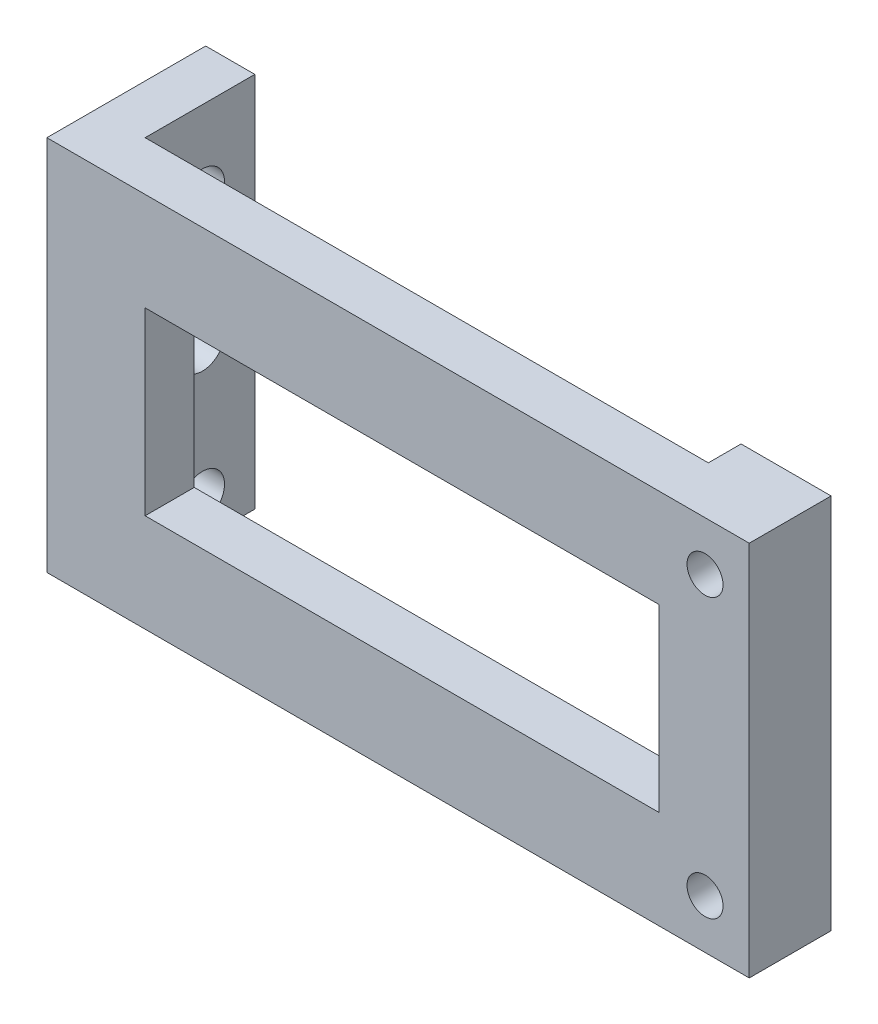
ISO-10303-21;
HEADER;
FILE_DESCRIPTION(('STEP AP214'),'2;1');
FILE_NAME('part.step','',(''),(''),'','','');
FILE_SCHEMA(('AUTOMOTIVE_DESIGN { 1 0 10303 214 1 1 1 1 }'));
ENDSEC;
DATA;
#1=APPLICATION_CONTEXT('core data for automotive mechanical design processes');
#2=APPLICATION_PROTOCOL_DEFINITION('international standard','automotive_design',2000,#1);
#3=PRODUCT_CONTEXT('',#1,'mechanical');
#4=PRODUCT('Part','Part','',(#3));
#5=PRODUCT_RELATED_PRODUCT_CATEGORY('part','',(#4));
#6=PRODUCT_DEFINITION_FORMATION('','',#4);
#7=PRODUCT_DEFINITION_CONTEXT('part definition',#1,'design');
#8=PRODUCT_DEFINITION('design','',#6,#7);
#9=PRODUCT_DEFINITION_SHAPE('','',#8);
#10=(LENGTH_UNIT() NAMED_UNIT(*) SI_UNIT(.MILLI.,.METRE.));
#11=(NAMED_UNIT(*) PLANE_ANGLE_UNIT() SI_UNIT($,.RADIAN.));
#12=(NAMED_UNIT(*) SI_UNIT($,.STERADIAN.) SOLID_ANGLE_UNIT());
#13=UNCERTAINTY_MEASURE_WITH_UNIT(LENGTH_MEASURE(1.E-05),#10,'distance_accuracy_value','');
#14=(GEOMETRIC_REPRESENTATION_CONTEXT(3) GLOBAL_UNCERTAINTY_ASSIGNED_CONTEXT((#13)) GLOBAL_UNIT_ASSIGNED_CONTEXT((#10,
#11,#12)) REPRESENTATION_CONTEXT('',''));
#15=CARTESIAN_POINT('',(0.,0.,0.));
#16=DIRECTION('',(0.,0.,1.));
#17=DIRECTION('',(1.,0.,0.));
#18=AXIS2_PLACEMENT_3D('',#15,#16,#17);
#19=CARTESIAN_POINT('',(-14.6316233815926,-9.25000000000001,-6.5));
#20=DIRECTION('',(-1.,0.,0.));
#21=DIRECTION('',(0.,-1.,0.));
#22=AXIS2_PLACEMENT_3D('',#19,#20,#21);
#23=CYLINDRICAL_SURFACE('',#22,1.35);
#24=CARTESIAN_POINT('',(-18.45,-9.25000000000001,-6.5));
#25=DIRECTION('',(-1.,0.,0.));
#26=DIRECTION('',(0.,-1.,0.));
#27=AXIS2_PLACEMENT_3D('',#24,#25,#26);
#28=CIRCLE('',#27,1.35);
#29=CARTESIAN_POINT('',(-18.45,-10.6,-6.5));
#30=VERTEX_POINT('',#29);
#31=EDGE_CURVE('E50',#30,#30,#28,.F.);
#32=ORIENTED_EDGE('',*,*,#31,.T.);
#33=EDGE_LOOP('',(#32));
#34=FACE_BOUND('',#33,.T.);
#35=CARTESIAN_POINT('',(-21.45,-9.25000000000001,-6.5));
#36=DIRECTION('',(-1.,0.,0.));
#37=DIRECTION('',(0.,-1.,0.));
#38=AXIS2_PLACEMENT_3D('',#35,#36,#37);
#39=CIRCLE('',#38,1.35);
#40=CARTESIAN_POINT('',(-21.45,-10.6,-6.5));
#41=VERTEX_POINT('',#40);
#42=EDGE_CURVE('E11',#41,#41,#39,.T.);
#43=ORIENTED_EDGE('',*,*,#42,.T.);
#44=EDGE_LOOP('',(#43));
#45=FACE_BOUND('',#44,.T.);
#46=ADVANCED_FACE('F41',(#34,#45),#23,.F.);
#47=CARTESIAN_POINT('',(0.,-5.5,-3.));
#48=DIRECTION('',(0.,-1.,0.));
#49=DIRECTION('',(0.,0.,-1.));
#50=AXIS2_PLACEMENT_3D('',#47,#48,#49);
#51=PLANE('',#50);
#52=DIRECTION('',(1.,0.,0.));
#53=VECTOR('',#52,1.);
#54=CARTESIAN_POINT('',(0.,-5.5,0.));
#55=LINE('',#54,#53);
#56=CARTESIAN_POINT('',(-15.45,-5.5,0.));
#57=VERTEX_POINT('',#56);
#58=CARTESIAN_POINT('',(15.95,-5.5,0.));
#59=VERTEX_POINT('',#58);
#60=EDGE_CURVE('E79',#57,#59,#55,.T.);
#61=ORIENTED_EDGE('',*,*,#60,.T.);
#62=DIRECTION('',(0.,0.,1.));
#63=VECTOR('',#62,1.);
#64=CARTESIAN_POINT('',(15.95,-5.5,-3.));
#65=LINE('',#64,#63);
#66=CARTESIAN_POINT('',(15.95,-5.5,-3.));
#67=VERTEX_POINT('',#66);
#68=EDGE_CURVE('E230',#67,#59,#65,.T.);
#69=ORIENTED_EDGE('',*,*,#68,.F.);
#70=DIRECTION('',(1.,0.,0.));
#71=VECTOR('',#70,1.);
#72=CARTESIAN_POINT('',(0.,-5.5,-3.));
#73=LINE('',#72,#71);
#74=CARTESIAN_POINT('',(-15.45,-5.5,-3.));
#75=VERTEX_POINT('',#74);
#76=EDGE_CURVE('E58',#75,#67,#73,.T.);
#77=ORIENTED_EDGE('',*,*,#76,.F.);
#78=DIRECTION('',(0.,0.,1.));
#79=VECTOR('',#78,1.);
#80=CARTESIAN_POINT('',(-15.45,-5.5,-3.));
#81=LINE('',#80,#79);
#82=EDGE_CURVE('E239',#75,#57,#81,.T.);
#83=ORIENTED_EDGE('',*,*,#82,.T.);
#84=EDGE_LOOP('',(#61,#69,#77,#83));
#85=FACE_BOUND('',#84,.T.);
#86=ADVANCED_FACE('F264',(#85),#51,.F.);
#87=CARTESIAN_POINT('',(0.,-11.5,-3.));
#88=DIRECTION('',(0.,1.,0.));
#89=DIRECTION('',(-1.,0.,0.));
#90=AXIS2_PLACEMENT_3D('',#87,#88,#89);
#91=PLANE('',#90);
#92=DIRECTION('',(-1.,0.,0.));
#93=VECTOR('',#92,1.);
#94=CARTESIAN_POINT('',(0.,-11.5,0.));
#95=LINE('',#94,#93);
#96=CARTESIAN_POINT('',(21.45,-11.5,0.));
#97=VERTEX_POINT('',#96);
#98=CARTESIAN_POINT('',(-21.45,-11.5,0.));
#99=VERTEX_POINT('',#98);
#100=EDGE_CURVE('E202',#97,#99,#95,.T.);
#101=ORIENTED_EDGE('',*,*,#100,.T.);
#102=DIRECTION('',(0.,0.,1.));
#103=VECTOR('',#102,1.);
#104=CARTESIAN_POINT('',(-21.45,-11.5,-9.7));
#105=LINE('',#104,#103);
#106=CARTESIAN_POINT('',(-21.45,-11.5,-9.7));
#107=VERTEX_POINT('',#106);
#108=EDGE_CURVE('E139',#107,#99,#105,.T.);
#109=ORIENTED_EDGE('',*,*,#108,.F.);
#110=DIRECTION('',(-1.,0.,0.));
#111=VECTOR('',#110,1.);
#112=CARTESIAN_POINT('',(0.,-11.5,-9.7));
#113=LINE('',#112,#111);
#114=CARTESIAN_POINT('',(-18.45,-11.5,-9.7));
#115=VERTEX_POINT('',#114);
#116=EDGE_CURVE('E134',#115,#107,#113,.T.);
#117=ORIENTED_EDGE('',*,*,#116,.F.);
#118=DIRECTION('',(0.,0.,1.));
#119=VECTOR('',#118,1.);
#120=CARTESIAN_POINT('',(-18.45,-11.5,-9.7));
#121=LINE('',#120,#119);
#122=CARTESIAN_POINT('',(-18.45,-11.5,-3.));
#123=VERTEX_POINT('',#122);
#124=EDGE_CURVE('E175',#115,#123,#121,.T.);
#125=ORIENTED_EDGE('',*,*,#124,.T.);
#126=DIRECTION('',(-1.,0.,0.));
#127=VECTOR('',#126,1.);
#128=CARTESIAN_POINT('',(0.,-11.5,-3.));
#129=LINE('',#128,#127);
#130=CARTESIAN_POINT('',(15.95,-11.5,-3.));
#131=VERTEX_POINT('',#130);
#132=EDGE_CURVE('E105',#131,#123,#129,.T.);
#133=ORIENTED_EDGE('',*,*,#132,.F.);
#134=DIRECTION('',(0.,0.,1.));
#135=VECTOR('',#134,1.);
#136=CARTESIAN_POINT('',(15.95,-11.5,-5.));
#137=LINE('',#136,#135);
#138=CARTESIAN_POINT('',(15.95,-11.5,-5.));
#139=VERTEX_POINT('',#138);
#140=EDGE_CURVE('E194',#139,#131,#137,.T.);
#141=ORIENTED_EDGE('',*,*,#140,.F.);
#142=DIRECTION('',(-1.,0.,0.));
#143=VECTOR('',#142,1.);
#144=CARTESIAN_POINT('',(0.,-11.5,-5.));
#145=LINE('',#144,#143);
#146=CARTESIAN_POINT('',(21.45,-11.5,-5.));
#147=VERTEX_POINT('',#146);
#148=EDGE_CURVE('E162',#147,#139,#145,.T.);
#149=ORIENTED_EDGE('',*,*,#148,.F.);
#150=DIRECTION('',(0.,0.,1.));
#151=VECTOR('',#150,1.);
#152=CARTESIAN_POINT('',(21.45,-11.5,-5.));
#153=LINE('',#152,#151);
#154=EDGE_CURVE('E190',#147,#97,#153,.T.);
#155=ORIENTED_EDGE('',*,*,#154,.T.);
#156=EDGE_LOOP('',(#101,#109,#117,#125,#133,#141,#149,#155));
#157=FACE_BOUND('',#156,.T.);
#158=ADVANCED_FACE('F268',(#157),#91,.F.);
#159=CARTESIAN_POINT('',(0.,11.5,-3.));
#160=DIRECTION('',(0.,1.,0.));
#161=DIRECTION('',(-1.,0.,0.));
#162=AXIS2_PLACEMENT_3D('',#159,#160,#161);
#163=PLANE('',#162);
#164=DIRECTION('',(-1.,0.,0.));
#165=VECTOR('',#164,1.);
#166=CARTESIAN_POINT('',(0.,11.5,0.));
#167=LINE('',#166,#165);
#168=CARTESIAN_POINT('',(21.45,11.5,0.));
#169=VERTEX_POINT('',#168);
#170=CARTESIAN_POINT('',(-21.45,11.5,0.));
#171=VERTEX_POINT('',#170);
#172=EDGE_CURVE('E223',#169,#171,#167,.T.);
#173=ORIENTED_EDGE('',*,*,#172,.F.);
#174=DIRECTION('',(0.,0.,1.));
#175=VECTOR('',#174,1.);
#176=CARTESIAN_POINT('',(21.45,11.5,-5.));
#177=LINE('',#176,#175);
#178=CARTESIAN_POINT('',(21.45,11.5,-5.));
#179=VERTEX_POINT('',#178);
#180=EDGE_CURVE('E186',#179,#169,#177,.T.);
#181=ORIENTED_EDGE('',*,*,#180,.F.);
#182=DIRECTION('',(-1.,0.,0.));
#183=VECTOR('',#182,1.);
#184=CARTESIAN_POINT('',(0.,11.5,-5.));
#185=LINE('',#184,#183);
#186=CARTESIAN_POINT('',(15.95,11.5,-5.));
#187=VERTEX_POINT('',#186);
#188=EDGE_CURVE('E155',#179,#187,#185,.T.);
#189=ORIENTED_EDGE('',*,*,#188,.T.);
#190=DIRECTION('',(0.,0.,1.));
#191=VECTOR('',#190,1.);
#192=CARTESIAN_POINT('',(15.95,11.5,-5.));
#193=LINE('',#192,#191);
#194=CARTESIAN_POINT('',(15.95,11.5,-3.));
#195=VERTEX_POINT('',#194);
#196=EDGE_CURVE('E123',#187,#195,#193,.T.);
#197=ORIENTED_EDGE('',*,*,#196,.T.);
#198=DIRECTION('',(-1.,0.,0.));
#199=VECTOR('',#198,1.);
#200=CARTESIAN_POINT('',(0.,11.5,-3.));
#201=LINE('',#200,#199);
#202=CARTESIAN_POINT('',(-18.45,11.5,-3.));
#203=VERTEX_POINT('',#202);
#204=EDGE_CURVE('E101',#195,#203,#201,.T.);
#205=ORIENTED_EDGE('',*,*,#204,.T.);
#206=DIRECTION('',(0.,0.,1.));
#207=VECTOR('',#206,1.);
#208=CARTESIAN_POINT('',(-18.45,11.5,-9.7));
#209=LINE('',#208,#207);
#210=CARTESIAN_POINT('',(-18.45,11.5,-9.7));
#211=VERTEX_POINT('',#210);
#212=EDGE_CURVE('E119',#211,#203,#209,.T.);
#213=ORIENTED_EDGE('',*,*,#212,.F.);
#214=DIRECTION('',(-1.,0.,0.));
#215=VECTOR('',#214,1.);
#216=CARTESIAN_POINT('',(0.,11.5,-9.7));
#217=LINE('',#216,#215);
#218=CARTESIAN_POINT('',(-21.45,11.5,-9.7));
#219=VERTEX_POINT('',#218);
#220=EDGE_CURVE('E348',#211,#219,#217,.T.);
#221=ORIENTED_EDGE('',*,*,#220,.T.);
#222=DIRECTION('',(0.,0.,1.));
#223=VECTOR('',#222,1.);
#224=CARTESIAN_POINT('',(-21.45,11.5,-9.7));
#225=LINE('',#224,#223);
#226=EDGE_CURVE('E133',#219,#171,#225,.T.);
#227=ORIENTED_EDGE('',*,*,#226,.T.);
#228=EDGE_LOOP('',(#173,#181,#189,#197,#205,#213,#221,#227));
#229=FACE_BOUND('',#228,.T.);
#230=ADVANCED_FACE('F116',(#229),#163,.T.);
#231=CARTESIAN_POINT('',(0.,5.5,-3.));
#232=DIRECTION('',(0.,-1.,0.));
#233=DIRECTION('',(1.,0.,0.));
#234=AXIS2_PLACEMENT_3D('',#231,#232,#233);
#235=PLANE('',#234);
#236=DIRECTION('',(1.,0.,0.));
#237=VECTOR('',#236,1.);
#238=CARTESIAN_POINT('',(0.,5.5,0.));
#239=LINE('',#238,#237);
#240=CARTESIAN_POINT('',(-15.45,5.5,0.));
#241=VERTEX_POINT('',#240);
#242=CARTESIAN_POINT('',(15.95,5.5,0.));
#243=VERTEX_POINT('',#242);
#244=EDGE_CURVE('E219',#241,#243,#239,.T.);
#245=ORIENTED_EDGE('',*,*,#244,.F.);
#246=DIRECTION('',(0.,0.,1.));
#247=VECTOR('',#246,1.);
#248=CARTESIAN_POINT('',(-15.45,5.5,-3.));
#249=LINE('',#248,#247);
#250=CARTESIAN_POINT('',(-15.45,5.5,-3.));
#251=VERTEX_POINT('',#250);
#252=EDGE_CURVE('E72',#251,#241,#249,.T.);
#253=ORIENTED_EDGE('',*,*,#252,.F.);
#254=DIRECTION('',(1.,0.,0.));
#255=VECTOR('',#254,1.);
#256=CARTESIAN_POINT('',(0.,5.5,-3.));
#257=LINE('',#256,#255);
#258=CARTESIAN_POINT('',(15.95,5.5,-3.));
#259=VERTEX_POINT('',#258);
#260=EDGE_CURVE('E205',#251,#259,#257,.T.);
#261=ORIENTED_EDGE('',*,*,#260,.T.);
#262=DIRECTION('',(0.,0.,1.));
#263=VECTOR('',#262,1.);
#264=CARTESIAN_POINT('',(15.95,5.5,-3.));
#265=LINE('',#264,#263);
#266=EDGE_CURVE('E233',#259,#243,#265,.T.);
#267=ORIENTED_EDGE('',*,*,#266,.T.);
#268=EDGE_LOOP('',(#245,#253,#261,#267));
#269=FACE_BOUND('',#268,.T.);
#270=ADVANCED_FACE('F278',(#269),#235,.T.);
#271=CARTESIAN_POINT('',(-15.45,0.,-3.));
#272=DIRECTION('',(-1.,0.,0.));
#273=DIRECTION('',(0.,0.,1.));
#274=AXIS2_PLACEMENT_3D('',#271,#272,#273);
#275=PLANE('',#274);
#276=DIRECTION('',(0.,-1.,0.));
#277=VECTOR('',#276,1.);
#278=CARTESIAN_POINT('',(-15.45,0.,0.));
#279=LINE('',#278,#277);
#280=EDGE_CURVE('E216',#241,#57,#279,.T.);
#281=ORIENTED_EDGE('',*,*,#280,.T.);
#282=ORIENTED_EDGE('',*,*,#82,.F.);
#283=DIRECTION('',(0.,-1.,0.));
#284=VECTOR('',#283,1.);
#285=CARTESIAN_POINT('',(-15.45,0.,-3.));
#286=LINE('',#285,#284);
#287=EDGE_CURVE('E84',#251,#75,#286,.T.);
#288=ORIENTED_EDGE('',*,*,#287,.F.);
#289=ORIENTED_EDGE('',*,*,#252,.T.);
#290=EDGE_LOOP('',(#281,#282,#288,#289));
#291=FACE_BOUND('',#290,.T.);
#292=ADVANCED_FACE('F275',(#291),#275,.F.);
#293=CARTESIAN_POINT('',(0.,0.,-3.));
#294=DIRECTION('',(0.,0.,1.));
#295=DIRECTION('',(1.,0.,0.));
#296=AXIS2_PLACEMENT_3D('',#293,#294,#295);
#297=PLANE('',#296);
#298=ORIENTED_EDGE('',*,*,#76,.T.);
#299=DIRECTION('',(0.,-1.,0.));
#300=VECTOR('',#299,1.);
#301=CARTESIAN_POINT('',(15.95,0.,-3.));
#302=LINE('',#301,#300);
#303=EDGE_CURVE('E210',#67,#131,#302,.T.);
#304=ORIENTED_EDGE('',*,*,#303,.T.);
#305=ORIENTED_EDGE('',*,*,#132,.T.);
#306=DIRECTION('',(0.,-1.,0.));
#307=VECTOR('',#306,1.);
#308=CARTESIAN_POINT('',(-18.45,0.,-3.));
#309=LINE('',#308,#307);
#310=EDGE_CURVE('E98',#203,#123,#309,.T.);
#311=ORIENTED_EDGE('',*,*,#310,.F.);
#312=ORIENTED_EDGE('',*,*,#204,.F.);
#313=EDGE_CURVE('E125',#195,#259,#302,.T.);
#314=ORIENTED_EDGE('',*,*,#313,.T.);
#315=ORIENTED_EDGE('',*,*,#260,.F.);
#316=ORIENTED_EDGE('',*,*,#287,.T.);
#317=EDGE_LOOP('',(#298,#304,#305,#311,#312,#314,#315,#316));
#318=FACE_BOUND('',#317,.T.);
#319=ADVANCED_FACE('F100',(#318),#297,.F.);
#320=CARTESIAN_POINT('',(0.,0.,0.));
#321=DIRECTION('',(0.,0.,1.));
#322=DIRECTION('',(1.,0.,0.));
#323=AXIS2_PLACEMENT_3D('',#320,#321,#322);
#324=PLANE('',#323);
#325=ORIENTED_EDGE('',*,*,#244,.T.);
#326=DIRECTION('',(0.,-1.,0.));
#327=VECTOR('',#326,1.);
#328=CARTESIAN_POINT('',(15.95,0.,0.));
#329=LINE('',#328,#327);
#330=EDGE_CURVE('E179',#243,#59,#329,.T.);
#331=ORIENTED_EDGE('',*,*,#330,.T.);
#332=ORIENTED_EDGE('',*,*,#60,.F.);
#333=ORIENTED_EDGE('',*,*,#280,.F.);
#334=EDGE_LOOP('',(#325,#331,#332,#333));
#335=FACE_BOUND('',#334,.T.);
#336=DIRECTION('',(0.,-1.,0.));
#337=VECTOR('',#336,1.);
#338=CARTESIAN_POINT('',(21.45,0.,0.));
#339=LINE('',#338,#337);
#340=EDGE_CURVE('E151',#169,#97,#339,.T.);
#341=ORIENTED_EDGE('',*,*,#340,.F.);
#342=ORIENTED_EDGE('',*,*,#172,.T.);
#343=DIRECTION('',(0.,-1.,0.));
#344=VECTOR('',#343,1.);
#345=CARTESIAN_POINT('',(-21.45,0.,0.));
#346=LINE('',#345,#344);
#347=EDGE_CURVE('E346',#171,#99,#346,.T.);
#348=ORIENTED_EDGE('',*,*,#347,.T.);
#349=ORIENTED_EDGE('',*,*,#100,.F.);
#350=EDGE_LOOP('',(#341,#342,#348,#349));
#351=FACE_BOUND('',#350,.T.);
#352=CARTESIAN_POINT('',(18.75,8.5,0.));
#353=DIRECTION('',(0.,0.,1.));
#354=DIRECTION('',(1.,0.,0.));
#355=AXIS2_PLACEMENT_3D('',#352,#353,#354);
#356=CIRCLE('',#355,1.1);
#357=CARTESIAN_POINT('',(19.85,8.5,0.));
#358=VERTEX_POINT('',#357);
#359=EDGE_CURVE('E170',#358,#358,#356,.T.);
#360=ORIENTED_EDGE('',*,*,#359,.F.);
#361=EDGE_LOOP('',(#360));
#362=FACE_BOUND('',#361,.T.);
#363=CARTESIAN_POINT('',(18.75,-8.5,0.));
#364=DIRECTION('',(0.,0.,1.));
#365=DIRECTION('',(1.,0.,0.));
#366=AXIS2_PLACEMENT_3D('',#363,#364,#365);
#367=CIRCLE('',#366,1.1);
#368=CARTESIAN_POINT('',(19.85,-8.5,0.));
#369=VERTEX_POINT('',#368);
#370=EDGE_CURVE('E174',#369,#369,#367,.T.);
#371=ORIENTED_EDGE('',*,*,#370,.F.);
#372=EDGE_LOOP('',(#371));
#373=FACE_BOUND('',#372,.T.);
#374=ADVANCED_FACE('F284',(#335,#351,#362,#373),#324,.T.);
#375=CARTESIAN_POINT('',(15.95,0.,-5.));
#376=DIRECTION('',(-1.,0.,0.));
#377=DIRECTION('',(0.,-1.,0.));
#378=AXIS2_PLACEMENT_3D('',#375,#376,#377);
#379=PLANE('',#378);
#380=ORIENTED_EDGE('',*,*,#330,.F.);
#381=ORIENTED_EDGE('',*,*,#266,.F.);
#382=ORIENTED_EDGE('',*,*,#313,.F.);
#383=ORIENTED_EDGE('',*,*,#196,.F.);
#384=DIRECTION('',(0.,-1.,0.));
#385=VECTOR('',#384,1.);
#386=CARTESIAN_POINT('',(15.95,0.,-5.));
#387=LINE('',#386,#385);
#388=EDGE_CURVE('E158',#187,#139,#387,.T.);
#389=ORIENTED_EDGE('',*,*,#388,.T.);
#390=ORIENTED_EDGE('',*,*,#140,.T.);
#391=ORIENTED_EDGE('',*,*,#303,.F.);
#392=ORIENTED_EDGE('',*,*,#68,.T.);
#393=EDGE_LOOP('',(#380,#381,#382,#383,#389,#390,#391,#392));
#394=FACE_BOUND('',#393,.T.);
#395=ADVANCED_FACE('F287',(#394),#379,.T.);
#396=CARTESIAN_POINT('',(21.45,0.,-5.));
#397=DIRECTION('',(-1.,0.,0.));
#398=DIRECTION('',(0.,-1.,0.));
#399=AXIS2_PLACEMENT_3D('',#396,#397,#398);
#400=PLANE('',#399);
#401=ORIENTED_EDGE('',*,*,#340,.T.);
#402=ORIENTED_EDGE('',*,*,#154,.F.);
#403=DIRECTION('',(0.,-1.,0.));
#404=VECTOR('',#403,1.);
#405=CARTESIAN_POINT('',(21.45,0.,-5.));
#406=LINE('',#405,#404);
#407=EDGE_CURVE('E166',#179,#147,#406,.T.);
#408=ORIENTED_EDGE('',*,*,#407,.F.);
#409=ORIENTED_EDGE('',*,*,#180,.T.);
#410=EDGE_LOOP('',(#401,#402,#408,#409));
#411=FACE_BOUND('',#410,.T.);
#412=ADVANCED_FACE('F297',(#411),#400,.F.);
#413=CARTESIAN_POINT('',(18.75,-8.5,-5.));
#414=DIRECTION('',(0.,0.,1.));
#415=DIRECTION('',(1.,0.,0.));
#416=AXIS2_PLACEMENT_3D('',#413,#414,#415);
#417=CYLINDRICAL_SURFACE('',#416,1.1);
#418=CARTESIAN_POINT('',(18.75,-8.5,-5.));
#419=DIRECTION('',(0.,0.,1.));
#420=DIRECTION('',(1.,0.,0.));
#421=AXIS2_PLACEMENT_3D('',#418,#419,#420);
#422=CIRCLE('',#421,1.1);
#423=CARTESIAN_POINT('',(19.85,-8.5,-5.));
#424=VERTEX_POINT('',#423);
#425=EDGE_CURVE('E150',#424,#424,#422,.T.);
#426=ORIENTED_EDGE('',*,*,#425,.F.);
#427=EDGE_LOOP('',(#426));
#428=FACE_BOUND('',#427,.T.);
#429=ORIENTED_EDGE('',*,*,#370,.T.);
#430=EDGE_LOOP('',(#429));
#431=FACE_BOUND('',#430,.T.);
#432=ADVANCED_FACE('F293',(#428,#431),#417,.F.);
#433=CARTESIAN_POINT('',(18.75,8.5,-5.));
#434=DIRECTION('',(0.,0.,1.));
#435=DIRECTION('',(1.,0.,0.));
#436=AXIS2_PLACEMENT_3D('',#433,#434,#435);
#437=CYLINDRICAL_SURFACE('',#436,1.1);
#438=CARTESIAN_POINT('',(18.75,8.5,-5.));
#439=DIRECTION('',(0.,0.,1.));
#440=DIRECTION('',(1.,0.,0.));
#441=AXIS2_PLACEMENT_3D('',#438,#439,#440);
#442=CIRCLE('',#441,1.1);
#443=CARTESIAN_POINT('',(19.85,8.5,-5.));
#444=VERTEX_POINT('',#443);
#445=EDGE_CURVE('E146',#444,#444,#442,.T.);
#446=ORIENTED_EDGE('',*,*,#445,.F.);
#447=EDGE_LOOP('',(#446));
#448=FACE_BOUND('',#447,.T.);
#449=ORIENTED_EDGE('',*,*,#359,.T.);
#450=EDGE_LOOP('',(#449));
#451=FACE_BOUND('',#450,.T.);
#452=ADVANCED_FACE('F258',(#448,#451),#437,.F.);
#453=CARTESIAN_POINT('',(0.,0.,-5.));
#454=DIRECTION('',(0.,0.,1.));
#455=DIRECTION('',(1.,0.,0.));
#456=AXIS2_PLACEMENT_3D('',#453,#454,#455);
#457=PLANE('',#456);
#458=ORIENTED_EDGE('',*,*,#445,.T.);
#459=EDGE_LOOP('',(#458));
#460=FACE_BOUND('',#459,.T.);
#461=ORIENTED_EDGE('',*,*,#425,.T.);
#462=EDGE_LOOP('',(#461));
#463=FACE_BOUND('',#462,.T.);
#464=ORIENTED_EDGE('',*,*,#188,.F.);
#465=ORIENTED_EDGE('',*,*,#407,.T.);
#466=ORIENTED_EDGE('',*,*,#148,.T.);
#467=ORIENTED_EDGE('',*,*,#388,.F.);
#468=EDGE_LOOP('',(#464,#465,#466,#467));
#469=FACE_BOUND('',#468,.T.);
#470=ADVANCED_FACE('F248',(#460,#463,#469),#457,.F.);
#471=CARTESIAN_POINT('',(-18.45,0.,-9.7));
#472=DIRECTION('',(-1.,0.,0.));
#473=DIRECTION('',(0.,-1.,0.));
#474=AXIS2_PLACEMENT_3D('',#471,#472,#473);
#475=PLANE('',#474);
#476=CARTESIAN_POINT('',(-18.45,-1.25,-6.5));
#477=DIRECTION('',(-1.,0.,0.));
#478=DIRECTION('',(0.,-1.,0.));
#479=AXIS2_PLACEMENT_3D('',#476,#477,#478);
#480=CIRCLE('',#479,1.35);
#481=CARTESIAN_POINT('',(-18.45,-2.6,-6.5));
#482=VERTEX_POINT('',#481);
#483=EDGE_CURVE('E385',#482,#482,#480,.F.);
#484=ORIENTED_EDGE('',*,*,#483,.F.);
#485=EDGE_LOOP('',(#484));
#486=FACE_BOUND('',#485,.T.);
#487=CARTESIAN_POINT('',(-18.45,6.75,-6.5));
#488=DIRECTION('',(-1.,0.,0.));
#489=DIRECTION('',(0.,-1.,0.));
#490=AXIS2_PLACEMENT_3D('',#487,#488,#489);
#491=CIRCLE('',#490,1.35);
#492=CARTESIAN_POINT('',(-18.45,5.4,-6.5));
#493=VERTEX_POINT('',#492);
#494=EDGE_CURVE('E360',#493,#493,#491,.F.);
#495=ORIENTED_EDGE('',*,*,#494,.F.);
#496=EDGE_LOOP('',(#495));
#497=FACE_BOUND('',#496,.T.);
#498=ORIENTED_EDGE('',*,*,#212,.T.);
#499=ORIENTED_EDGE('',*,*,#310,.T.);
#500=ORIENTED_EDGE('',*,*,#124,.F.);
#501=DIRECTION('',(0.,-1.,0.));
#502=VECTOR('',#501,1.);
#503=CARTESIAN_POINT('',(-18.45,0.,-9.7));
#504=LINE('',#503,#502);
#505=EDGE_CURVE('E130',#211,#115,#504,.T.);
#506=ORIENTED_EDGE('',*,*,#505,.F.);
#507=EDGE_LOOP('',(#498,#499,#500,#506));
#508=FACE_BOUND('',#507,.T.);
#509=ORIENTED_EDGE('',*,*,#31,.F.);
#510=EDGE_LOOP('',(#509));
#511=FACE_BOUND('',#510,.T.);
#512=ADVANCED_FACE('F127',(#486,#497,#508,#511),#475,.F.);
#513=CARTESIAN_POINT('',(-21.45,0.,-9.7));
#514=DIRECTION('',(-1.,0.,0.));
#515=DIRECTION('',(0.,-1.,0.));
#516=AXIS2_PLACEMENT_3D('',#513,#514,#515);
#517=PLANE('',#516);
#518=CARTESIAN_POINT('',(-21.45,-1.25,-6.5));
#519=DIRECTION('',(-1.,0.,0.));
#520=DIRECTION('',(0.,-1.,0.));
#521=AXIS2_PLACEMENT_3D('',#518,#519,#520);
#522=CIRCLE('',#521,1.35);
#523=CARTESIAN_POINT('',(-21.45,-2.6,-6.5));
#524=VERTEX_POINT('',#523);
#525=EDGE_CURVE('E379',#524,#524,#522,.T.);
#526=ORIENTED_EDGE('',*,*,#525,.F.);
#527=EDGE_LOOP('',(#526));
#528=FACE_BOUND('',#527,.T.);
#529=CARTESIAN_POINT('',(-21.45,6.75,-6.5));
#530=DIRECTION('',(-1.,0.,0.));
#531=DIRECTION('',(0.,-1.,0.));
#532=AXIS2_PLACEMENT_3D('',#529,#530,#531);
#533=CIRCLE('',#532,1.35);
#534=CARTESIAN_POINT('',(-21.45,5.4,-6.5));
#535=VERTEX_POINT('',#534);
#536=EDGE_CURVE('E374',#535,#535,#533,.T.);
#537=ORIENTED_EDGE('',*,*,#536,.F.);
#538=EDGE_LOOP('',(#537));
#539=FACE_BOUND('',#538,.T.);
#540=ORIENTED_EDGE('',*,*,#347,.F.);
#541=ORIENTED_EDGE('',*,*,#226,.F.);
#542=DIRECTION('',(0.,-1.,0.));
#543=VECTOR('',#542,1.);
#544=CARTESIAN_POINT('',(-21.45,0.,-9.7));
#545=LINE('',#544,#543);
#546=EDGE_CURVE('E142',#219,#107,#545,.T.);
#547=ORIENTED_EDGE('',*,*,#546,.T.);
#548=ORIENTED_EDGE('',*,*,#108,.T.);
#549=EDGE_LOOP('',(#540,#541,#547,#548));
#550=FACE_BOUND('',#549,.T.);
#551=ORIENTED_EDGE('',*,*,#42,.F.);
#552=EDGE_LOOP('',(#551));
#553=FACE_BOUND('',#552,.T.);
#554=ADVANCED_FACE('F247',(#528,#539,#550,#553),#517,.T.);
#555=CARTESIAN_POINT('',(0.,0.,-9.7));
#556=DIRECTION('',(0.,0.,1.));
#557=DIRECTION('',(1.,0.,0.));
#558=AXIS2_PLACEMENT_3D('',#555,#556,#557);
#559=PLANE('',#558);
#560=ORIENTED_EDGE('',*,*,#505,.T.);
#561=ORIENTED_EDGE('',*,*,#116,.T.);
#562=ORIENTED_EDGE('',*,*,#546,.F.);
#563=ORIENTED_EDGE('',*,*,#220,.F.);
#564=EDGE_LOOP('',(#560,#561,#562,#563));
#565=FACE_BOUND('',#564,.T.);
#566=ADVANCED_FACE('F255',(#565),#559,.F.);
#567=CARTESIAN_POINT('',(-14.6316233815926,6.75,-6.5));
#568=DIRECTION('',(-1.,0.,0.));
#569=DIRECTION('',(0.,-1.,0.));
#570=AXIS2_PLACEMENT_3D('',#567,#568,#569);
#571=CYLINDRICAL_SURFACE('',#570,1.35);
#572=ORIENTED_EDGE('',*,*,#494,.T.);
#573=EDGE_LOOP('',(#572));
#574=FACE_BOUND('',#573,.T.);
#575=ORIENTED_EDGE('',*,*,#536,.T.);
#576=EDGE_LOOP('',(#575));
#577=FACE_BOUND('',#576,.T.);
#578=ADVANCED_FACE('F392',(#574,#577),#571,.F.);
#579=CARTESIAN_POINT('',(-14.6316233815926,-1.25,-6.5));
#580=DIRECTION('',(-1.,0.,0.));
#581=DIRECTION('',(0.,-1.,0.));
#582=AXIS2_PLACEMENT_3D('',#579,#580,#581);
#583=CYLINDRICAL_SURFACE('',#582,1.35);
#584=ORIENTED_EDGE('',*,*,#483,.T.);
#585=EDGE_LOOP('',(#584));
#586=FACE_BOUND('',#585,.T.);
#587=ORIENTED_EDGE('',*,*,#525,.T.);
#588=EDGE_LOOP('',(#587));
#589=FACE_BOUND('',#588,.T.);
#590=ADVANCED_FACE('F389',(#586,#589),#583,.F.);
#591=CLOSED_SHELL('',(#46,#86,#158,#230,#270,#292,#319,#374,#395,#412,#432,#452,#470,#512,#554,
#566,#578,#590));
#592=MANIFOLD_SOLID_BREP('B2',#591);
#593=ADVANCED_BREP_SHAPE_REPRESENTATION('',(#18,#592),#14);
#594=SHAPE_DEFINITION_REPRESENTATION(#9,#593);
ENDSEC;
END-ISO-10303-21;
